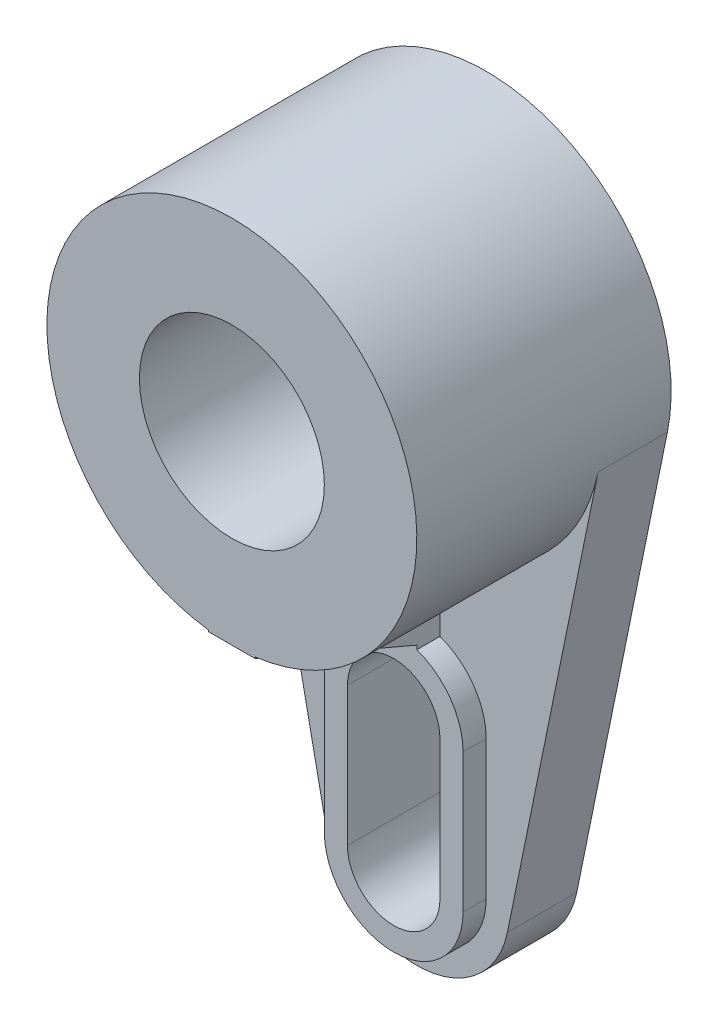
ISO-10303-21;
HEADER;
FILE_DESCRIPTION(('STEP AP214'),'2;1');
FILE_NAME('part.step','',(''),(''),'','','');
FILE_SCHEMA(('AUTOMOTIVE_DESIGN { 1 0 10303 214 1 1 1 1 }'));
ENDSEC;
DATA;
#1=APPLICATION_CONTEXT('core data for automotive mechanical design processes');
#2=APPLICATION_PROTOCOL_DEFINITION('international standard','automotive_design',2000,#1);
#3=PRODUCT_CONTEXT('',#1,'mechanical');
#4=PRODUCT('Part','Part','',(#3));
#5=PRODUCT_RELATED_PRODUCT_CATEGORY('part','',(#4));
#6=PRODUCT_DEFINITION_FORMATION('','',#4);
#7=PRODUCT_DEFINITION_CONTEXT('part definition',#1,'design');
#8=PRODUCT_DEFINITION('design','',#6,#7);
#9=PRODUCT_DEFINITION_SHAPE('','',#8);
#10=(LENGTH_UNIT() NAMED_UNIT(*) SI_UNIT(.MILLI.,.METRE.));
#11=(NAMED_UNIT(*) PLANE_ANGLE_UNIT() SI_UNIT($,.RADIAN.));
#12=(NAMED_UNIT(*) SI_UNIT($,.STERADIAN.) SOLID_ANGLE_UNIT());
#13=UNCERTAINTY_MEASURE_WITH_UNIT(LENGTH_MEASURE(1.E-05),#10,'distance_accuracy_value','');
#14=(GEOMETRIC_REPRESENTATION_CONTEXT(3) GLOBAL_UNCERTAINTY_ASSIGNED_CONTEXT((#13)) GLOBAL_UNIT_ASSIGNED_CONTEXT((#10,
#11,#12)) REPRESENTATION_CONTEXT('',''));
#15=CARTESIAN_POINT('',(0.,0.,0.));
#16=DIRECTION('',(0.,0.,1.));
#17=DIRECTION('',(1.,0.,0.));
#18=AXIS2_PLACEMENT_3D('',#15,#16,#17);
#19=CARTESIAN_POINT('',(0.,0.,15.));
#20=DIRECTION('',(0.,0.,1.));
#21=DIRECTION('',(1.,0.,0.));
#22=AXIS2_PLACEMENT_3D('',#19,#20,#21);
#23=PLANE('',#22);
#24=CARTESIAN_POINT('',(0.,0.,15.));
#25=DIRECTION('',(0.,0.,1.));
#26=DIRECTION('',(1.,0.,0.));
#27=AXIS2_PLACEMENT_3D('',#24,#25,#26);
#28=CIRCLE('',#27,40.);
#29=CARTESIAN_POINT('',(5.,-39.6862696659689,15.));
#30=VERTEX_POINT('',#29);
#31=CARTESIAN_POINT('',(39.1918358845308,-8.,15.));
#32=VERTEX_POINT('',#31);
#33=EDGE_CURVE('E154',#30,#32,#28,.T.);
#34=ORIENTED_EDGE('',*,*,#33,.F.);
#35=DIRECTION('',(0.,1.,0.));
#36=VECTOR('',#35,1.);
#37=CARTESIAN_POINT('',(5.,-39.,15.));
#38=LINE('',#37,#36);
#39=CARTESIAN_POINT('',(5.,-55.8578643762691,15.));
#40=VERTEX_POINT('',#39);
#41=EDGE_CURVE('E299',#40,#30,#38,.T.);
#42=ORIENTED_EDGE('',*,*,#41,.F.);
#43=CARTESIAN_POINT('',(0.,-70.,15.));
#44=DIRECTION('',(0.,0.,1.));
#45=DIRECTION('',(1.,0.,0.));
#46=AXIS2_PLACEMENT_3D('',#43,#44,#45);
#47=CIRCLE('',#46,15.);
#48=CARTESIAN_POINT('',(15.,-70.,15.));
#49=VERTEX_POINT('',#48);
#50=EDGE_CURVE('E101',#49,#40,#47,.T.);
#51=ORIENTED_EDGE('',*,*,#50,.F.);
#52=DIRECTION('',(0.,1.,0.));
#53=VECTOR('',#52,1.);
#54=CARTESIAN_POINT('',(15.,0.,15.));
#55=LINE('',#54,#53);
#56=CARTESIAN_POINT('',(15.,-100.,15.));
#57=VERTEX_POINT('',#56);
#58=EDGE_CURVE('E97',#57,#49,#55,.T.);
#59=ORIENTED_EDGE('',*,*,#58,.F.);
#60=CARTESIAN_POINT('',(0.,-100.,15.));
#61=DIRECTION('',(0.,0.,1.));
#62=DIRECTION('',(1.,0.,0.));
#63=AXIS2_PLACEMENT_3D('',#60,#61,#62);
#64=CIRCLE('',#63,15.);
#65=CARTESIAN_POINT('',(-15.,-100.,15.));
#66=VERTEX_POINT('',#65);
#67=EDGE_CURVE('E90',#66,#57,#64,.T.);
#68=ORIENTED_EDGE('',*,*,#67,.F.);
#69=DIRECTION('',(0.,1.,0.));
#70=VECTOR('',#69,1.);
#71=CARTESIAN_POINT('',(-15.,0.,15.));
#72=LINE('',#71,#70);
#73=CARTESIAN_POINT('',(-15.,-70.,15.));
#74=VERTEX_POINT('',#73);
#75=EDGE_CURVE('E117',#66,#74,#72,.T.);
#76=ORIENTED_EDGE('',*,*,#75,.T.);
#77=CARTESIAN_POINT('',(-5.,-55.8578643762691,15.));
#78=VERTEX_POINT('',#77);
#79=EDGE_CURVE('E147',#78,#74,#47,.T.);
#80=ORIENTED_EDGE('',*,*,#79,.F.);
#81=DIRECTION('',(0.,1.,0.));
#82=VECTOR('',#81,1.);
#83=CARTESIAN_POINT('',(-5.,-39.,15.));
#84=LINE('',#83,#82);
#85=CARTESIAN_POINT('',(-5.,-39.6862696659689,15.));
#86=VERTEX_POINT('',#85);
#87=EDGE_CURVE('E273',#78,#86,#84,.T.);
#88=ORIENTED_EDGE('',*,*,#87,.T.);
#89=CARTESIAN_POINT('',(-39.1918358845308,-8.,15.));
#90=VERTEX_POINT('',#89);
#91=EDGE_CURVE('E155',#90,#86,#28,.T.);
#92=ORIENTED_EDGE('',*,*,#91,.F.);
#93=DIRECTION('',(-0.2,0.979795897113271,0.));
#94=VECTOR('',#93,1.);
#95=CARTESIAN_POINT('',(-39.1918358845308,-8.,15.));
#96=LINE('',#95,#94);
#97=CARTESIAN_POINT('',(-19.5959179422654,-104.,15.));
#98=VERTEX_POINT('',#97);
#99=EDGE_CURVE('E106',#98,#90,#96,.T.);
#100=ORIENTED_EDGE('',*,*,#99,.F.);
#101=CARTESIAN_POINT('',(0.,-100.,15.));
#102=DIRECTION('',(0.,0.,1.));
#103=DIRECTION('',(1.,0.,0.));
#104=AXIS2_PLACEMENT_3D('',#101,#102,#103);
#105=CIRCLE('',#104,20.);
#106=CARTESIAN_POINT('',(19.5959179422654,-104.,15.));
#107=VERTEX_POINT('',#106);
#108=EDGE_CURVE('E151',#98,#107,#105,.T.);
#109=ORIENTED_EDGE('',*,*,#108,.T.);
#110=DIRECTION('',(0.2,0.979795897113271,0.));
#111=VECTOR('',#110,1.);
#112=CARTESIAN_POINT('',(39.1918358845308,-8.,15.));
#113=LINE('',#112,#111);
#114=EDGE_CURVE('E63',#107,#32,#113,.T.);
#115=ORIENTED_EDGE('',*,*,#114,.T.);
#116=EDGE_LOOP('',(#34,#42,#51,#59,#68,#76,#80,#88,#92,#100,#109,#115));
#117=FACE_BOUND('',#116,.T.);
#118=ADVANCED_FACE('F39',(#117),#23,.T.);
#119=CARTESIAN_POINT('',(0.,-70.,20.));
#120=DIRECTION('',(0.,0.,-1.));
#121=DIRECTION('',(-1.,0.,0.));
#122=AXIS2_PLACEMENT_3D('',#119,#120,#121);
#123=CYLINDRICAL_SURFACE('',#122,15.);
#124=DIRECTION('',(0.,0.,-1.));
#125=VECTOR('',#124,1.);
#126=CARTESIAN_POINT('',(5.,-55.8578643762691,20.));
#127=LINE('',#126,#125);
#128=CARTESIAN_POINT('',(5.,-55.8578643762691,20.));
#129=VERTEX_POINT('',#128);
#130=EDGE_CURVE('E301',#129,#40,#127,.T.);
#131=ORIENTED_EDGE('',*,*,#130,.F.);
#132=CARTESIAN_POINT('',(0.,-70.,20.));
#133=DIRECTION('',(0.,0.,1.));
#134=DIRECTION('',(1.,0.,0.));
#135=AXIS2_PLACEMENT_3D('',#132,#133,#134);
#136=CIRCLE('',#135,15.);
#137=CARTESIAN_POINT('',(15.,-70.,20.));
#138=VERTEX_POINT('',#137);
#139=EDGE_CURVE('E137',#138,#129,#136,.T.);
#140=ORIENTED_EDGE('',*,*,#139,.F.);
#141=DIRECTION('',(0.,0.,-1.));
#142=VECTOR('',#141,1.);
#143=CARTESIAN_POINT('',(15.,-70.,20.));
#144=LINE('',#143,#142);
#145=EDGE_CURVE('E125',#138,#49,#144,.T.);
#146=ORIENTED_EDGE('',*,*,#145,.T.);
#147=ORIENTED_EDGE('',*,*,#50,.T.);
#148=EDGE_LOOP('',(#131,#140,#146,#147));
#149=FACE_BOUND('',#148,.T.);
#150=ADVANCED_FACE('F346',(#149),#123,.T.);
#151=CARTESIAN_POINT('',(0.,0.,55.));
#152=DIRECTION('',(0.,0.,-1.));
#153=DIRECTION('',(-1.,0.,0.));
#154=AXIS2_PLACEMENT_3D('',#151,#152,#153);
#155=CYLINDRICAL_SURFACE('',#154,40.);
#156=DIRECTION('',(0.,0.,-1.));
#157=VECTOR('',#156,1.);
#158=CARTESIAN_POINT('',(5.,-39.6862696659689,55.));
#159=LINE('',#158,#157);
#160=CARTESIAN_POINT('',(5.,-39.6862696659689,55.));
#161=VERTEX_POINT('',#160);
#162=EDGE_CURVE('E292',#30,#161,#159,.F.);
#163=ORIENTED_EDGE('',*,*,#162,.F.);
#164=ORIENTED_EDGE('',*,*,#33,.T.);
#165=DIRECTION('',(0.,0.,-1.));
#166=VECTOR('',#165,1.);
#167=CARTESIAN_POINT('',(39.1918358845308,-8.,15.));
#168=LINE('',#167,#166);
#169=CARTESIAN_POINT('',(39.1918358845308,-8.,0.));
#170=VERTEX_POINT('',#169);
#171=EDGE_CURVE('E167',#32,#170,#168,.T.);
#172=ORIENTED_EDGE('',*,*,#171,.T.);
#173=CARTESIAN_POINT('',(0.,0.,0.));
#174=DIRECTION('',(0.,0.,1.));
#175=DIRECTION('',(1.,0.,0.));
#176=AXIS2_PLACEMENT_3D('',#173,#174,#175);
#177=CIRCLE('',#176,40.);
#178=CARTESIAN_POINT('',(-39.1918358845309,-8.,0.));
#179=VERTEX_POINT('',#178);
#180=EDGE_CURVE('E81',#170,#179,#177,.T.);
#181=ORIENTED_EDGE('',*,*,#180,.T.);
#182=DIRECTION('',(0.,0.,-1.));
#183=VECTOR('',#182,1.);
#184=CARTESIAN_POINT('',(-39.1918358845308,-8.,15.));
#185=LINE('',#184,#183);
#186=EDGE_CURVE('E158',#90,#179,#185,.T.);
#187=ORIENTED_EDGE('',*,*,#186,.F.);
#188=ORIENTED_EDGE('',*,*,#91,.T.);
#189=DIRECTION('',(0.,0.,-1.));
#190=VECTOR('',#189,1.);
#191=CARTESIAN_POINT('',(-5.,-39.6862696659689,55.));
#192=LINE('',#191,#190);
#193=CARTESIAN_POINT('',(-5.,-39.6862696659689,55.));
#194=VERTEX_POINT('',#193);
#195=EDGE_CURVE('E311',#86,#194,#192,.F.);
#196=ORIENTED_EDGE('',*,*,#195,.T.);
#197=CARTESIAN_POINT('',(0.,0.,55.));
#198=DIRECTION('',(0.,0.,1.));
#199=DIRECTION('',(1.,0.,0.));
#200=AXIS2_PLACEMENT_3D('',#197,#198,#199);
#201=CIRCLE('',#200,40.);
#202=EDGE_CURVE('E244',#161,#194,#201,.T.);
#203=ORIENTED_EDGE('',*,*,#202,.F.);
#204=EDGE_LOOP('',(#163,#164,#172,#181,#187,#188,#196,#203));
#205=FACE_BOUND('',#204,.T.);
#206=ADVANCED_FACE('F188',(#205),#155,.T.);
#207=CARTESIAN_POINT('',(-39.1918358845308,-8.,15.));
#208=DIRECTION('',(-0.979795897113271,-0.2,0.));
#209=DIRECTION('',(0.2,-0.979795897113271,0.));
#210=AXIS2_PLACEMENT_3D('',#207,#208,#209);
#211=PLANE('',#210);
#212=DIRECTION('',(-0.2,0.979795897113271,0.));
#213=VECTOR('',#212,1.);
#214=CARTESIAN_POINT('',(-39.1918358845308,-8.,0.));
#215=LINE('',#214,#213);
#216=CARTESIAN_POINT('',(-19.5959179422654,-104.,0.));
#217=VERTEX_POINT('',#216);
#218=EDGE_CURVE('E127',#217,#179,#215,.T.);
#219=ORIENTED_EDGE('',*,*,#218,.F.);
#220=DIRECTION('',(0.,0.,-1.));
#221=VECTOR('',#220,1.);
#222=CARTESIAN_POINT('',(-19.5959179422654,-104.,15.));
#223=LINE('',#222,#221);
#224=EDGE_CURVE('E11',#98,#217,#223,.T.);
#225=ORIENTED_EDGE('',*,*,#224,.F.);
#226=ORIENTED_EDGE('',*,*,#99,.T.);
#227=ORIENTED_EDGE('',*,*,#186,.T.);
#228=EDGE_LOOP('',(#219,#225,#226,#227));
#229=FACE_BOUND('',#228,.T.);
#230=ADVANCED_FACE('F41',(#229),#211,.T.);
#231=CARTESIAN_POINT('',(0.,-100.,15.));
#232=DIRECTION('',(0.,0.,-1.));
#233=DIRECTION('',(-1.,0.,0.));
#234=AXIS2_PLACEMENT_3D('',#231,#232,#233);
#235=CYLINDRICAL_SURFACE('',#234,20.);
#236=CARTESIAN_POINT('',(0.,-100.,0.));
#237=DIRECTION('',(0.,0.,1.));
#238=DIRECTION('',(1.,0.,0.));
#239=AXIS2_PLACEMENT_3D('',#236,#237,#238);
#240=CIRCLE('',#239,20.);
#241=CARTESIAN_POINT('',(19.5959179422654,-104.,0.));
#242=VERTEX_POINT('',#241);
#243=EDGE_CURVE('E160',#217,#242,#240,.T.);
#244=ORIENTED_EDGE('',*,*,#243,.T.);
#245=DIRECTION('',(0.,0.,-1.));
#246=VECTOR('',#245,1.);
#247=CARTESIAN_POINT('',(19.5959179422654,-104.,15.));
#248=LINE('',#247,#246);
#249=EDGE_CURVE('E47',#107,#242,#248,.T.);
#250=ORIENTED_EDGE('',*,*,#249,.F.);
#251=ORIENTED_EDGE('',*,*,#108,.F.);
#252=ORIENTED_EDGE('',*,*,#224,.T.);
#253=EDGE_LOOP('',(#244,#250,#251,#252));
#254=FACE_BOUND('',#253,.T.);
#255=ADVANCED_FACE('F173',(#254),#235,.T.);
#256=CARTESIAN_POINT('',(39.1918358845308,-8.,15.));
#257=DIRECTION('',(-0.979795897113271,0.2,0.));
#258=DIRECTION('',(-0.2,-0.979795897113271,0.));
#259=AXIS2_PLACEMENT_3D('',#256,#257,#258);
#260=PLANE('',#259);
#261=DIRECTION('',(0.2,0.979795897113271,0.));
#262=VECTOR('',#261,1.);
#263=CARTESIAN_POINT('',(39.1918358845308,-8.,0.));
#264=LINE('',#263,#262);
#265=EDGE_CURVE('E118',#242,#170,#264,.T.);
#266=ORIENTED_EDGE('',*,*,#265,.T.);
#267=ORIENTED_EDGE('',*,*,#171,.F.);
#268=ORIENTED_EDGE('',*,*,#114,.F.);
#269=ORIENTED_EDGE('',*,*,#249,.T.);
#270=EDGE_LOOP('',(#266,#267,#268,#269));
#271=FACE_BOUND('',#270,.T.);
#272=ADVANCED_FACE('F169',(#271),#260,.F.);
#273=CARTESIAN_POINT('',(0.,0.,0.));
#274=DIRECTION('',(0.,0.,1.));
#275=DIRECTION('',(1.,0.,0.));
#276=AXIS2_PLACEMENT_3D('',#273,#274,#275);
#277=PLANE('',#276);
#278=ORIENTED_EDGE('',*,*,#218,.T.);
#279=ORIENTED_EDGE('',*,*,#180,.F.);
#280=ORIENTED_EDGE('',*,*,#265,.F.);
#281=ORIENTED_EDGE('',*,*,#243,.F.);
#282=EDGE_LOOP('',(#278,#279,#280,#281));
#283=FACE_BOUND('',#282,.T.);
#284=CARTESIAN_POINT('',(0.,-70.,0.));
#285=DIRECTION('',(0.,0.,1.));
#286=DIRECTION('',(1.,0.,0.));
#287=AXIS2_PLACEMENT_3D('',#284,#285,#286);
#288=CIRCLE('',#287,10.);
#289=CARTESIAN_POINT('',(10.,-70.,0.));
#290=VERTEX_POINT('',#289);
#291=CARTESIAN_POINT('',(-10.,-70.,0.));
#292=VERTEX_POINT('',#291);
#293=EDGE_CURVE('E228',#290,#292,#288,.T.);
#294=ORIENTED_EDGE('',*,*,#293,.T.);
#295=DIRECTION('',(0.,1.,0.));
#296=VECTOR('',#295,1.);
#297=CARTESIAN_POINT('',(-10.,0.,0.));
#298=LINE('',#297,#296);
#299=CARTESIAN_POINT('',(-10.,-100.,0.));
#300=VERTEX_POINT('',#299);
#301=EDGE_CURVE('E235',#300,#292,#298,.T.);
#302=ORIENTED_EDGE('',*,*,#301,.F.);
#303=CARTESIAN_POINT('',(0.,-100.,0.));
#304=DIRECTION('',(0.,0.,1.));
#305=DIRECTION('',(1.,0.,0.));
#306=AXIS2_PLACEMENT_3D('',#303,#304,#305);
#307=CIRCLE('',#306,10.);
#308=CARTESIAN_POINT('',(10.,-100.,0.));
#309=VERTEX_POINT('',#308);
#310=EDGE_CURVE('E239',#300,#309,#307,.T.);
#311=ORIENTED_EDGE('',*,*,#310,.T.);
#312=DIRECTION('',(0.,1.,0.));
#313=VECTOR('',#312,1.);
#314=CARTESIAN_POINT('',(10.,0.,0.));
#315=LINE('',#314,#313);
#316=EDGE_CURVE('E243',#309,#290,#315,.T.);
#317=ORIENTED_EDGE('',*,*,#316,.T.);
#318=EDGE_LOOP('',(#294,#302,#311,#317));
#319=FACE_BOUND('',#318,.T.);
#320=CARTESIAN_POINT('',(0.,0.,0.));
#321=DIRECTION('',(0.,0.,1.));
#322=DIRECTION('',(1.,0.,0.));
#323=AXIS2_PLACEMENT_3D('',#320,#321,#322);
#324=CIRCLE('',#323,20.);
#325=CARTESIAN_POINT('',(20.,0.,0.));
#326=VERTEX_POINT('',#325);
#327=EDGE_CURVE('E319',#326,#326,#324,.T.);
#328=ORIENTED_EDGE('',*,*,#327,.T.);
#329=EDGE_LOOP('',(#328));
#330=FACE_BOUND('',#329,.T.);
#331=ADVANCED_FACE('F175',(#283,#319,#330),#277,.F.);
#332=CARTESIAN_POINT('',(-15.,0.,20.));
#333=DIRECTION('',(-1.,0.,0.));
#334=DIRECTION('',(0.,0.,1.));
#335=AXIS2_PLACEMENT_3D('',#332,#333,#334);
#336=PLANE('',#335);
#337=DIRECTION('',(0.,0.,-1.));
#338=VECTOR('',#337,1.);
#339=CARTESIAN_POINT('',(-15.,-70.,20.));
#340=LINE('',#339,#338);
#341=CARTESIAN_POINT('',(-15.,-70.,20.));
#342=VERTEX_POINT('',#341);
#343=EDGE_CURVE('E129',#342,#74,#340,.T.);
#344=ORIENTED_EDGE('',*,*,#343,.T.);
#345=ORIENTED_EDGE('',*,*,#75,.F.);
#346=DIRECTION('',(0.,0.,-1.));
#347=VECTOR('',#346,1.);
#348=CARTESIAN_POINT('',(-15.,-100.,20.));
#349=LINE('',#348,#347);
#350=CARTESIAN_POINT('',(-15.,-100.,20.));
#351=VERTEX_POINT('',#350);
#352=EDGE_CURVE('E116',#351,#66,#349,.T.);
#353=ORIENTED_EDGE('',*,*,#352,.F.);
#354=DIRECTION('',(0.,1.,0.));
#355=VECTOR('',#354,1.);
#356=CARTESIAN_POINT('',(-15.,0.,20.));
#357=LINE('',#356,#355);
#358=EDGE_CURVE('E259',#351,#342,#357,.T.);
#359=ORIENTED_EDGE('',*,*,#358,.T.);
#360=EDGE_LOOP('',(#344,#345,#353,#359));
#361=FACE_BOUND('',#360,.T.);
#362=ADVANCED_FACE('F257',(#361),#336,.T.);
#363=CARTESIAN_POINT('',(0.,-100.,20.));
#364=DIRECTION('',(0.,0.,-1.));
#365=DIRECTION('',(-1.,0.,0.));
#366=AXIS2_PLACEMENT_3D('',#363,#364,#365);
#367=CYLINDRICAL_SURFACE('',#366,15.);
#368=ORIENTED_EDGE('',*,*,#67,.T.);
#369=DIRECTION('',(0.,0.,-1.));
#370=VECTOR('',#369,1.);
#371=CARTESIAN_POINT('',(15.,-100.,20.));
#372=LINE('',#371,#370);
#373=CARTESIAN_POINT('',(15.,-100.,20.));
#374=VERTEX_POINT('',#373);
#375=EDGE_CURVE('E114',#374,#57,#372,.T.);
#376=ORIENTED_EDGE('',*,*,#375,.F.);
#377=CARTESIAN_POINT('',(0.,-100.,20.));
#378=DIRECTION('',(0.,0.,1.));
#379=DIRECTION('',(1.,0.,0.));
#380=AXIS2_PLACEMENT_3D('',#377,#378,#379);
#381=CIRCLE('',#380,15.);
#382=EDGE_CURVE('E335',#351,#374,#381,.T.);
#383=ORIENTED_EDGE('',*,*,#382,.F.);
#384=ORIENTED_EDGE('',*,*,#352,.T.);
#385=EDGE_LOOP('',(#368,#376,#383,#384));
#386=FACE_BOUND('',#385,.T.);
#387=ADVANCED_FACE('F111',(#386),#367,.T.);
#388=CARTESIAN_POINT('',(15.,0.,20.));
#389=DIRECTION('',(-1.,0.,0.));
#390=DIRECTION('',(0.,0.,1.));
#391=AXIS2_PLACEMENT_3D('',#388,#389,#390);
#392=PLANE('',#391);
#393=ORIENTED_EDGE('',*,*,#58,.T.);
#394=ORIENTED_EDGE('',*,*,#145,.F.);
#395=DIRECTION('',(0.,1.,0.));
#396=VECTOR('',#395,1.);
#397=CARTESIAN_POINT('',(15.,0.,20.));
#398=LINE('',#397,#396);
#399=EDGE_CURVE('E123',#374,#138,#398,.T.);
#400=ORIENTED_EDGE('',*,*,#399,.F.);
#401=ORIENTED_EDGE('',*,*,#375,.T.);
#402=EDGE_LOOP('',(#393,#394,#400,#401));
#403=FACE_BOUND('',#402,.T.);
#404=ADVANCED_FACE('F121',(#403),#392,.F.);
#405=CARTESIAN_POINT('',(0.,-70.,20.));
#406=DIRECTION('',(0.,0.,-1.));
#407=DIRECTION('',(-1.,0.,0.));
#408=AXIS2_PLACEMENT_3D('',#405,#406,#407);
#409=CYLINDRICAL_SURFACE('',#408,10.);
#410=ORIENTED_EDGE('',*,*,#293,.F.);
#411=DIRECTION('',(0.,0.,-1.));
#412=VECTOR('',#411,1.);
#413=CARTESIAN_POINT('',(10.,-70.,20.));
#414=LINE('',#413,#412);
#415=CARTESIAN_POINT('',(10.,-70.,20.));
#416=VERTEX_POINT('',#415);
#417=EDGE_CURVE('E143',#416,#290,#414,.T.);
#418=ORIENTED_EDGE('',*,*,#417,.F.);
#419=CARTESIAN_POINT('',(0.,-70.,20.));
#420=DIRECTION('',(0.,0.,1.));
#421=DIRECTION('',(1.,0.,0.));
#422=AXIS2_PLACEMENT_3D('',#419,#420,#421);
#423=CIRCLE('',#422,10.);
#424=CARTESIAN_POINT('',(-10.,-70.,20.));
#425=VERTEX_POINT('',#424);
#426=EDGE_CURVE('E231',#416,#425,#423,.T.);
#427=ORIENTED_EDGE('',*,*,#426,.T.);
#428=DIRECTION('',(0.,0.,-1.));
#429=VECTOR('',#428,1.);
#430=CARTESIAN_POINT('',(-10.,-70.,20.));
#431=LINE('',#430,#429);
#432=EDGE_CURVE('E133',#425,#292,#431,.T.);
#433=ORIENTED_EDGE('',*,*,#432,.T.);
#434=EDGE_LOOP('',(#410,#418,#427,#433));
#435=FACE_BOUND('',#434,.T.);
#436=ADVANCED_FACE('F226',(#435),#409,.F.);
#437=CARTESIAN_POINT('',(10.,0.,20.));
#438=DIRECTION('',(-1.,0.,0.));
#439=DIRECTION('',(0.,0.,1.));
#440=AXIS2_PLACEMENT_3D('',#437,#438,#439);
#441=PLANE('',#440);
#442=ORIENTED_EDGE('',*,*,#316,.F.);
#443=DIRECTION('',(0.,0.,-1.));
#444=VECTOR('',#443,1.);
#445=CARTESIAN_POINT('',(10.,-100.,20.));
#446=LINE('',#445,#444);
#447=CARTESIAN_POINT('',(10.,-100.,20.));
#448=VERTEX_POINT('',#447);
#449=EDGE_CURVE('E140',#448,#309,#446,.T.);
#450=ORIENTED_EDGE('',*,*,#449,.F.);
#451=DIRECTION('',(0.,1.,0.));
#452=VECTOR('',#451,1.);
#453=CARTESIAN_POINT('',(10.,0.,20.));
#454=LINE('',#453,#452);
#455=EDGE_CURVE('E326',#448,#416,#454,.T.);
#456=ORIENTED_EDGE('',*,*,#455,.T.);
#457=ORIENTED_EDGE('',*,*,#417,.T.);
#458=EDGE_LOOP('',(#442,#450,#456,#457));
#459=FACE_BOUND('',#458,.T.);
#460=ADVANCED_FACE('F413',(#459),#441,.T.);
#461=CARTESIAN_POINT('',(0.,-100.,20.));
#462=DIRECTION('',(0.,0.,-1.));
#463=DIRECTION('',(-1.,0.,0.));
#464=AXIS2_PLACEMENT_3D('',#461,#462,#463);
#465=CYLINDRICAL_SURFACE('',#464,10.);
#466=ORIENTED_EDGE('',*,*,#310,.F.);
#467=DIRECTION('',(0.,0.,-1.));
#468=VECTOR('',#467,1.);
#469=CARTESIAN_POINT('',(-10.,-100.,20.));
#470=LINE('',#469,#468);
#471=CARTESIAN_POINT('',(-10.,-100.,20.));
#472=VERTEX_POINT('',#471);
#473=EDGE_CURVE('E136',#472,#300,#470,.T.);
#474=ORIENTED_EDGE('',*,*,#473,.F.);
#475=CARTESIAN_POINT('',(0.,-100.,20.));
#476=DIRECTION('',(0.,0.,1.));
#477=DIRECTION('',(1.,0.,0.));
#478=AXIS2_PLACEMENT_3D('',#475,#476,#477);
#479=CIRCLE('',#478,10.);
#480=EDGE_CURVE('E329',#472,#448,#479,.T.);
#481=ORIENTED_EDGE('',*,*,#480,.T.);
#482=ORIENTED_EDGE('',*,*,#449,.T.);
#483=EDGE_LOOP('',(#466,#474,#481,#482));
#484=FACE_BOUND('',#483,.T.);
#485=ADVANCED_FACE('F411',(#484),#465,.F.);
#486=CARTESIAN_POINT('',(-10.,0.,20.));
#487=DIRECTION('',(-1.,0.,0.));
#488=DIRECTION('',(0.,0.,1.));
#489=AXIS2_PLACEMENT_3D('',#486,#487,#488);
#490=PLANE('',#489);
#491=ORIENTED_EDGE('',*,*,#301,.T.);
#492=ORIENTED_EDGE('',*,*,#432,.F.);
#493=DIRECTION('',(0.,1.,0.));
#494=VECTOR('',#493,1.);
#495=CARTESIAN_POINT('',(-10.,0.,20.));
#496=LINE('',#495,#494);
#497=EDGE_CURVE('E332',#472,#425,#496,.T.);
#498=ORIENTED_EDGE('',*,*,#497,.F.);
#499=ORIENTED_EDGE('',*,*,#473,.T.);
#500=EDGE_LOOP('',(#491,#492,#498,#499));
#501=FACE_BOUND('',#500,.T.);
#502=ADVANCED_FACE('F236',(#501),#490,.F.);
#503=CARTESIAN_POINT('',(-5.,-55.8578643762691,20.));
#504=VERTEX_POINT('',#503);
#505=EDGE_CURVE('E266',#504,#342,#136,.T.);
#506=ORIENTED_EDGE('',*,*,#505,.F.);
#507=DIRECTION('',(0.,0.,-1.));
#508=VECTOR('',#507,1.);
#509=CARTESIAN_POINT('',(-5.,-55.8578643762691,20.));
#510=LINE('',#509,#508);
#511=EDGE_CURVE('E270',#504,#78,#510,.T.);
#512=ORIENTED_EDGE('',*,*,#511,.T.);
#513=ORIENTED_EDGE('',*,*,#79,.T.);
#514=ORIENTED_EDGE('',*,*,#343,.F.);
#515=EDGE_LOOP('',(#506,#512,#513,#514));
#516=FACE_BOUND('',#515,.T.);
#517=ADVANCED_FACE('F263',(#516),#123,.T.);
#518=CARTESIAN_POINT('',(0.,0.,20.));
#519=DIRECTION('',(0.,0.,1.));
#520=DIRECTION('',(1.,0.,0.));
#521=AXIS2_PLACEMENT_3D('',#518,#519,#520);
#522=PLANE('',#521);
#523=ORIENTED_EDGE('',*,*,#139,.T.);
#524=DIRECTION('',(0.,-1.,0.));
#525=VECTOR('',#524,1.);
#526=CARTESIAN_POINT('',(5.,-56.,20.));
#527=LINE('',#526,#525);
#528=CARTESIAN_POINT('',(5.,-55.,20.));
#529=VERTEX_POINT('',#528);
#530=EDGE_CURVE('E343',#529,#129,#527,.T.);
#531=ORIENTED_EDGE('',*,*,#530,.F.);
#532=DIRECTION('',(-1.,0.,0.));
#533=VECTOR('',#532,1.);
#534=CARTESIAN_POINT('',(5.,-55.,20.));
#535=LINE('',#534,#533);
#536=CARTESIAN_POINT('',(-5.,-55.,20.));
#537=VERTEX_POINT('',#536);
#538=EDGE_CURVE('E314',#529,#537,#535,.T.);
#539=ORIENTED_EDGE('',*,*,#538,.T.);
#540=DIRECTION('',(0.,-1.,0.));
#541=VECTOR('',#540,1.);
#542=CARTESIAN_POINT('',(-5.,-56.,20.));
#543=LINE('',#542,#541);
#544=EDGE_CURVE('E352',#537,#504,#543,.T.);
#545=ORIENTED_EDGE('',*,*,#544,.T.);
#546=ORIENTED_EDGE('',*,*,#505,.T.);
#547=ORIENTED_EDGE('',*,*,#358,.F.);
#548=ORIENTED_EDGE('',*,*,#382,.T.);
#549=ORIENTED_EDGE('',*,*,#399,.T.);
#550=EDGE_LOOP('',(#523,#531,#539,#545,#546,#547,#548,#549));
#551=FACE_BOUND('',#550,.T.);
#552=ORIENTED_EDGE('',*,*,#426,.F.);
#553=ORIENTED_EDGE('',*,*,#455,.F.);
#554=ORIENTED_EDGE('',*,*,#480,.F.);
#555=ORIENTED_EDGE('',*,*,#497,.T.);
#556=EDGE_LOOP('',(#552,#553,#554,#555));
#557=FACE_BOUND('',#556,.T.);
#558=ADVANCED_FACE('F340',(#551,#557),#522,.T.);
#559=CARTESIAN_POINT('',(0.,0.,55.));
#560=DIRECTION('',(0.,0.,-1.));
#561=DIRECTION('',(-1.,0.,0.));
#562=AXIS2_PLACEMENT_3D('',#559,#560,#561);
#563=CYLINDRICAL_SURFACE('',#562,20.);
#564=CARTESIAN_POINT('',(0.,0.,55.));
#565=DIRECTION('',(0.,0.,1.));
#566=DIRECTION('',(1.,0.,0.));
#567=AXIS2_PLACEMENT_3D('',#564,#565,#566);
#568=CIRCLE('',#567,20.);
#569=CARTESIAN_POINT('',(20.,0.,55.));
#570=VERTEX_POINT('',#569);
#571=EDGE_CURVE('E248',#570,#570,#568,.T.);
#572=ORIENTED_EDGE('',*,*,#571,.T.);
#573=EDGE_LOOP('',(#572));
#574=FACE_BOUND('',#573,.T.);
#575=ORIENTED_EDGE('',*,*,#327,.F.);
#576=EDGE_LOOP('',(#575));
#577=FACE_BOUND('',#576,.T.);
#578=ADVANCED_FACE('F400',(#574,#577),#563,.F.);
#579=CARTESIAN_POINT('',(0.,0.,55.));
#580=DIRECTION('',(0.,0.,1.));
#581=DIRECTION('',(1.,0.,0.));
#582=AXIS2_PLACEMENT_3D('',#579,#580,#581);
#583=PLANE('',#582);
#584=DIRECTION('',(0.,-1.,0.));
#585=VECTOR('',#584,1.);
#586=CARTESIAN_POINT('',(-5.,-40.,55.));
#587=LINE('',#586,#585);
#588=CARTESIAN_POINT('',(-5.,-40.,55.));
#589=VERTEX_POINT('',#588);
#590=EDGE_CURVE('E54',#194,#589,#587,.T.);
#591=ORIENTED_EDGE('',*,*,#590,.T.);
#592=DIRECTION('',(-1.,0.,0.));
#593=VECTOR('',#592,1.);
#594=CARTESIAN_POINT('',(5.,-40.,55.));
#595=LINE('',#594,#593);
#596=CARTESIAN_POINT('',(5.,-40.,55.));
#597=VERTEX_POINT('',#596);
#598=EDGE_CURVE('E307',#597,#589,#595,.T.);
#599=ORIENTED_EDGE('',*,*,#598,.F.);
#600=DIRECTION('',(0.,-1.,0.));
#601=VECTOR('',#600,1.);
#602=CARTESIAN_POINT('',(5.,-40.,55.));
#603=LINE('',#602,#601);
#604=EDGE_CURVE('E297',#161,#597,#603,.T.);
#605=ORIENTED_EDGE('',*,*,#604,.F.);
#606=ORIENTED_EDGE('',*,*,#202,.T.);
#607=EDGE_LOOP('',(#591,#599,#605,#606));
#608=FACE_BOUND('',#607,.T.);
#609=ORIENTED_EDGE('',*,*,#571,.F.);
#610=EDGE_LOOP('',(#609));
#611=FACE_BOUND('',#610,.T.);
#612=ADVANCED_FACE('F304',(#608,#611),#583,.T.);
#613=CARTESIAN_POINT('',(5.,0.,0.));
#614=DIRECTION('',(-1.,0.,0.));
#615=DIRECTION('',(0.,0.,1.));
#616=AXIS2_PLACEMENT_3D('',#613,#614,#615);
#617=PLANE('',#616);
#618=ORIENTED_EDGE('',*,*,#530,.T.);
#619=ORIENTED_EDGE('',*,*,#130,.T.);
#620=ORIENTED_EDGE('',*,*,#41,.T.);
#621=ORIENTED_EDGE('',*,*,#162,.T.);
#622=ORIENTED_EDGE('',*,*,#604,.T.);
#623=DIRECTION('',(0.,-0.393919298579168,-0.919145030018058));
#624=VECTOR('',#623,1.);
#625=CARTESIAN_POINT('',(5.,-55.,20.));
#626=LINE('',#625,#624);
#627=EDGE_CURVE('E309',#597,#529,#626,.T.);
#628=ORIENTED_EDGE('',*,*,#627,.T.);
#629=EDGE_LOOP('',(#618,#619,#620,#621,#622,#628));
#630=FACE_BOUND('',#629,.T.);
#631=ADVANCED_FACE('F294',(#630),#617,.F.);
#632=CARTESIAN_POINT('',(-5.,0.,0.));
#633=DIRECTION('',(-1.,0.,0.));
#634=DIRECTION('',(0.,0.,1.));
#635=AXIS2_PLACEMENT_3D('',#632,#633,#634);
#636=PLANE('',#635);
#637=ORIENTED_EDGE('',*,*,#511,.F.);
#638=ORIENTED_EDGE('',*,*,#544,.F.);
#639=DIRECTION('',(0.,-0.393919298579168,-0.919145030018058));
#640=VECTOR('',#639,1.);
#641=CARTESIAN_POINT('',(-5.,-55.,20.));
#642=LINE('',#641,#640);
#643=EDGE_CURVE('E348',#589,#537,#642,.T.);
#644=ORIENTED_EDGE('',*,*,#643,.F.);
#645=ORIENTED_EDGE('',*,*,#590,.F.);
#646=ORIENTED_EDGE('',*,*,#195,.F.);
#647=ORIENTED_EDGE('',*,*,#87,.F.);
#648=EDGE_LOOP('',(#637,#638,#644,#645,#646,#647));
#649=FACE_BOUND('',#648,.T.);
#650=ADVANCED_FACE('F363',(#649),#636,.T.);
#651=CARTESIAN_POINT('',(5.,-55.,20.));
#652=DIRECTION('',(0.,0.919145030018058,-0.393919298579168));
#653=DIRECTION('',(0.,0.393919298579168,0.919145030018058));
#654=AXIS2_PLACEMENT_3D('',#651,#652,#653);
#655=PLANE('',#654);
#656=ORIENTED_EDGE('',*,*,#643,.T.);
#657=ORIENTED_EDGE('',*,*,#538,.F.);
#658=ORIENTED_EDGE('',*,*,#627,.F.);
#659=ORIENTED_EDGE('',*,*,#598,.T.);
#660=EDGE_LOOP('',(#656,#657,#658,#659));
#661=FACE_BOUND('',#660,.T.);
#662=ADVANCED_FACE('F362',(#661),#655,.F.);
#663=CLOSED_SHELL('',(#118,#150,#206,#230,#255,#272,#331,#362,#387,#404,#436,#460,#485,#502,
#517,#558,#578,#612,#631,#650,#662));
#664=MANIFOLD_SOLID_BREP('B2',#663);
#665=ADVANCED_BREP_SHAPE_REPRESENTATION('',(#18,#664),#14);
#666=SHAPE_DEFINITION_REPRESENTATION(#9,#665);
ENDSEC;
END-ISO-10303-21;
